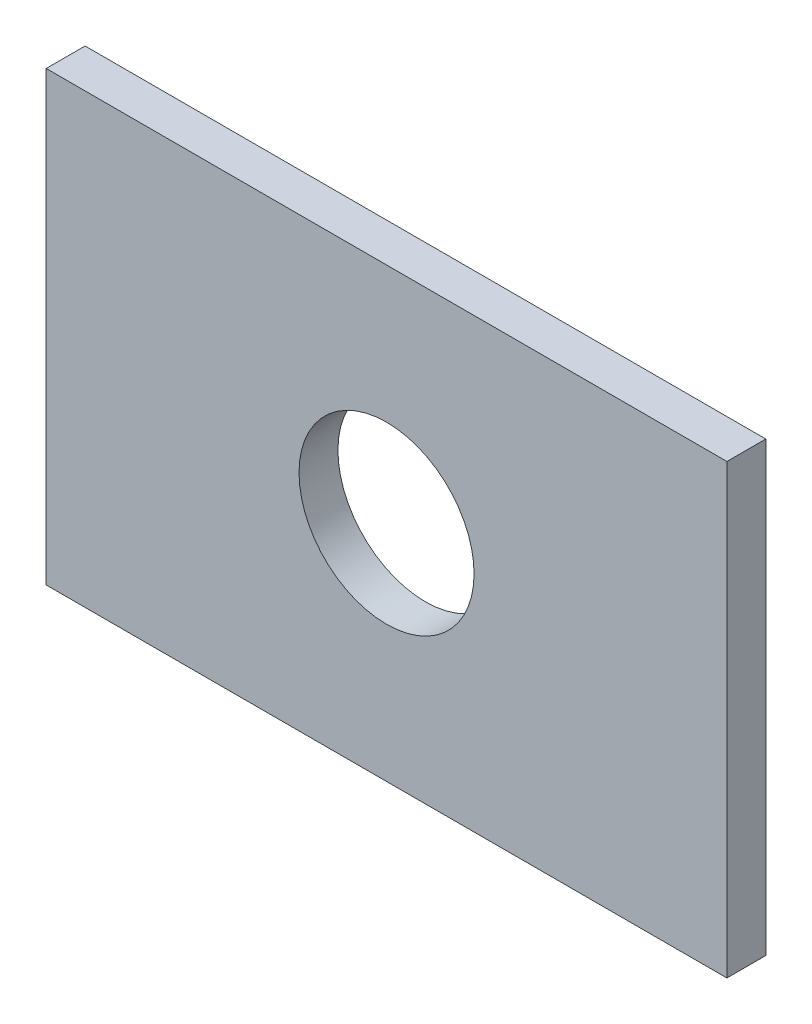
ISO-10303-21;
HEADER;
FILE_DESCRIPTION(('STEP AP214'),'2;1');
FILE_NAME('part.step','',(''),(''),'','','');
FILE_SCHEMA(('AUTOMOTIVE_DESIGN { 1 0 10303 214 1 1 1 1 }'));
ENDSEC;
DATA;
#1=APPLICATION_CONTEXT('core data for automotive mechanical design processes');
#2=APPLICATION_PROTOCOL_DEFINITION('international standard','automotive_design',2000,#1);
#3=PRODUCT_CONTEXT('',#1,'mechanical');
#4=PRODUCT('Part','Part','',(#3));
#5=PRODUCT_RELATED_PRODUCT_CATEGORY('part','',(#4));
#6=PRODUCT_DEFINITION_FORMATION('','',#4);
#7=PRODUCT_DEFINITION_CONTEXT('part definition',#1,'design');
#8=PRODUCT_DEFINITION('design','',#6,#7);
#9=PRODUCT_DEFINITION_SHAPE('','',#8);
#10=(LENGTH_UNIT() NAMED_UNIT(*) SI_UNIT(.MILLI.,.METRE.));
#11=(NAMED_UNIT(*) PLANE_ANGLE_UNIT() SI_UNIT($,.RADIAN.));
#12=(NAMED_UNIT(*) SI_UNIT($,.STERADIAN.) SOLID_ANGLE_UNIT());
#13=UNCERTAINTY_MEASURE_WITH_UNIT(LENGTH_MEASURE(1.E-05),#10,'distance_accuracy_value','');
#14=(GEOMETRIC_REPRESENTATION_CONTEXT(3) GLOBAL_UNCERTAINTY_ASSIGNED_CONTEXT((#13)) GLOBAL_UNIT_ASSIGNED_CONTEXT((#10,
#11,#12)) REPRESENTATION_CONTEXT('',''));
#15=CARTESIAN_POINT('',(0.,0.,0.));
#16=DIRECTION('',(0.,0.,1.));
#17=DIRECTION('',(1.,0.,0.));
#18=AXIS2_PLACEMENT_3D('',#15,#16,#17);
#19=CARTESIAN_POINT('',(0.,0.,2.));
#20=DIRECTION('',(0.,0.,-1.));
#21=DIRECTION('',(-1.,0.,0.));
#22=AXIS2_PLACEMENT_3D('',#19,#20,#21);
#23=PLANE('',#22);
#24=DIRECTION('',(0.,1.,0.));
#25=VECTOR('',#24,1.);
#26=CARTESIAN_POINT('',(17.5,-11.5,2.));
#27=LINE('',#26,#25);
#28=CARTESIAN_POINT('',(17.5,-11.5,2.));
#29=VERTEX_POINT('',#28);
#30=CARTESIAN_POINT('',(17.5,11.5,2.));
#31=VERTEX_POINT('',#30);
#32=EDGE_CURVE('E89',#29,#31,#27,.T.);
#33=ORIENTED_EDGE('',*,*,#32,.T.);
#34=DIRECTION('',(-1.,0.,0.));
#35=VECTOR('',#34,1.);
#36=CARTESIAN_POINT('',(-17.5,11.5,2.));
#37=LINE('',#36,#35);
#38=CARTESIAN_POINT('',(-17.5,11.5,2.));
#39=VERTEX_POINT('',#38);
#40=EDGE_CURVE('E84',#31,#39,#37,.T.);
#41=ORIENTED_EDGE('',*,*,#40,.T.);
#42=DIRECTION('',(0.,-1.,0.));
#43=VECTOR('',#42,1.);
#44=CARTESIAN_POINT('',(-17.5,-11.5,2.));
#45=LINE('',#44,#43);
#46=CARTESIAN_POINT('',(-17.5,-11.5,2.));
#47=VERTEX_POINT('',#46);
#48=EDGE_CURVE('E87',#39,#47,#45,.T.);
#49=ORIENTED_EDGE('',*,*,#48,.T.);
#50=DIRECTION('',(1.,0.,0.));
#51=VECTOR('',#50,1.);
#52=CARTESIAN_POINT('',(-17.5,-11.5,2.));
#53=LINE('',#52,#51);
#54=EDGE_CURVE('E54',#47,#29,#53,.T.);
#55=ORIENTED_EDGE('',*,*,#54,.T.);
#56=EDGE_LOOP('',(#33,#41,#49,#55));
#57=FACE_BOUND('',#56,.T.);
#58=CARTESIAN_POINT('',(0.,0.,2.));
#59=DIRECTION('',(0.,0.,1.));
#60=DIRECTION('',(1.,0.,0.));
#61=AXIS2_PLACEMENT_3D('',#58,#59,#60);
#62=CIRCLE('',#61,4.5);
#63=CARTESIAN_POINT('',(4.5,0.,2.));
#64=VERTEX_POINT('',#63);
#65=EDGE_CURVE('E104',#64,#64,#62,.T.);
#66=ORIENTED_EDGE('',*,*,#65,.F.);
#67=EDGE_LOOP('',(#66));
#68=FACE_BOUND('',#67,.T.);
#69=ADVANCED_FACE('F37',(#57,#68),#23,.F.);
#70=CARTESIAN_POINT('',(0.,0.,0.));
#71=DIRECTION('',(0.,0.,-1.));
#72=DIRECTION('',(-1.,0.,0.));
#73=AXIS2_PLACEMENT_3D('',#70,#71,#72);
#74=PLANE('',#73);
#75=DIRECTION('',(0.,1.,0.));
#76=VECTOR('',#75,1.);
#77=CARTESIAN_POINT('',(17.5,-11.5,0.));
#78=LINE('',#77,#76);
#79=CARTESIAN_POINT('',(17.5,-11.5,0.));
#80=VERTEX_POINT('',#79);
#81=CARTESIAN_POINT('',(17.5,11.5,0.));
#82=VERTEX_POINT('',#81);
#83=EDGE_CURVE('E101',#80,#82,#78,.T.);
#84=ORIENTED_EDGE('',*,*,#83,.F.);
#85=DIRECTION('',(1.,0.,0.));
#86=VECTOR('',#85,1.);
#87=CARTESIAN_POINT('',(-17.5,-11.5,0.));
#88=LINE('',#87,#86);
#89=CARTESIAN_POINT('',(-17.5,-11.5,0.));
#90=VERTEX_POINT('',#89);
#91=EDGE_CURVE('E77',#90,#80,#88,.T.);
#92=ORIENTED_EDGE('',*,*,#91,.F.);
#93=DIRECTION('',(0.,-1.,0.));
#94=VECTOR('',#93,1.);
#95=CARTESIAN_POINT('',(-17.5,-11.5,0.));
#96=LINE('',#95,#94);
#97=CARTESIAN_POINT('',(-17.5,11.5,0.));
#98=VERTEX_POINT('',#97);
#99=EDGE_CURVE('E71',#98,#90,#96,.T.);
#100=ORIENTED_EDGE('',*,*,#99,.F.);
#101=DIRECTION('',(-1.,0.,0.));
#102=VECTOR('',#101,1.);
#103=CARTESIAN_POINT('',(-17.5,11.5,0.));
#104=LINE('',#103,#102);
#105=EDGE_CURVE('E93',#82,#98,#104,.T.);
#106=ORIENTED_EDGE('',*,*,#105,.F.);
#107=EDGE_LOOP('',(#84,#92,#100,#106));
#108=FACE_BOUND('',#107,.T.);
#109=CARTESIAN_POINT('',(0.,0.,0.));
#110=DIRECTION('',(0.,0.,1.));
#111=DIRECTION('',(1.,0.,0.));
#112=AXIS2_PLACEMENT_3D('',#109,#110,#111);
#113=CIRCLE('',#112,4.5);
#114=CARTESIAN_POINT('',(4.5,0.,0.));
#115=VERTEX_POINT('',#114);
#116=EDGE_CURVE('E116',#115,#115,#113,.T.);
#117=ORIENTED_EDGE('',*,*,#116,.T.);
#118=EDGE_LOOP('',(#117));
#119=FACE_BOUND('',#118,.T.);
#120=ADVANCED_FACE('F112',(#108,#119),#74,.T.);
#121=CARTESIAN_POINT('',(17.5,-11.5,2.));
#122=DIRECTION('',(-1.,0.,0.));
#123=DIRECTION('',(0.,0.,1.));
#124=AXIS2_PLACEMENT_3D('',#121,#122,#123);
#125=PLANE('',#124);
#126=ORIENTED_EDGE('',*,*,#83,.T.);
#127=DIRECTION('',(0.,0.,-1.));
#128=VECTOR('',#127,1.);
#129=CARTESIAN_POINT('',(17.5,11.5,2.));
#130=LINE('',#129,#128);
#131=EDGE_CURVE('E11',#31,#82,#130,.T.);
#132=ORIENTED_EDGE('',*,*,#131,.F.);
#133=ORIENTED_EDGE('',*,*,#32,.F.);
#134=DIRECTION('',(0.,0.,-1.));
#135=VECTOR('',#134,1.);
#136=CARTESIAN_POINT('',(17.5,-11.5,2.));
#137=LINE('',#136,#135);
#138=EDGE_CURVE('E97',#29,#80,#137,.T.);
#139=ORIENTED_EDGE('',*,*,#138,.T.);
#140=EDGE_LOOP('',(#126,#132,#133,#139));
#141=FACE_BOUND('',#140,.T.);
#142=ADVANCED_FACE('F39',(#141),#125,.F.);
#143=CARTESIAN_POINT('',(-17.5,11.5,2.));
#144=DIRECTION('',(0.,-1.,0.));
#145=DIRECTION('',(0.,0.,-1.));
#146=AXIS2_PLACEMENT_3D('',#143,#144,#145);
#147=PLANE('',#146);
#148=ORIENTED_EDGE('',*,*,#105,.T.);
#149=DIRECTION('',(0.,0.,-1.));
#150=VECTOR('',#149,1.);
#151=CARTESIAN_POINT('',(-17.5,11.5,2.));
#152=LINE('',#151,#150);
#153=EDGE_CURVE('E46',#39,#98,#152,.T.);
#154=ORIENTED_EDGE('',*,*,#153,.F.);
#155=ORIENTED_EDGE('',*,*,#40,.F.);
#156=ORIENTED_EDGE('',*,*,#131,.T.);
#157=EDGE_LOOP('',(#148,#154,#155,#156));
#158=FACE_BOUND('',#157,.T.);
#159=ADVANCED_FACE('F92',(#158),#147,.F.);
#160=CARTESIAN_POINT('',(-17.5,-11.5,2.));
#161=DIRECTION('',(1.,0.,0.));
#162=DIRECTION('',(0.,0.,-1.));
#163=AXIS2_PLACEMENT_3D('',#160,#161,#162);
#164=PLANE('',#163);
#165=ORIENTED_EDGE('',*,*,#99,.T.);
#166=DIRECTION('',(0.,0.,-1.));
#167=VECTOR('',#166,1.);
#168=CARTESIAN_POINT('',(-17.5,-11.5,2.));
#169=LINE('',#168,#167);
#170=EDGE_CURVE('E94',#47,#90,#169,.T.);
#171=ORIENTED_EDGE('',*,*,#170,.F.);
#172=ORIENTED_EDGE('',*,*,#48,.F.);
#173=ORIENTED_EDGE('',*,*,#153,.T.);
#174=EDGE_LOOP('',(#165,#171,#172,#173));
#175=FACE_BOUND('',#174,.T.);
#176=ADVANCED_FACE('F95',(#175),#164,.F.);
#177=CARTESIAN_POINT('',(-17.5,-11.5,2.));
#178=DIRECTION('',(0.,1.,0.));
#179=DIRECTION('',(0.,0.,1.));
#180=AXIS2_PLACEMENT_3D('',#177,#178,#179);
#181=PLANE('',#180);
#182=ORIENTED_EDGE('',*,*,#91,.T.);
#183=ORIENTED_EDGE('',*,*,#138,.F.);
#184=ORIENTED_EDGE('',*,*,#54,.F.);
#185=ORIENTED_EDGE('',*,*,#170,.T.);
#186=EDGE_LOOP('',(#182,#183,#184,#185));
#187=FACE_BOUND('',#186,.T.);
#188=ADVANCED_FACE('F109',(#187),#181,.F.);
#189=CARTESIAN_POINT('',(0.,0.,2.));
#190=DIRECTION('',(0.,0.,-1.));
#191=DIRECTION('',(-1.,0.,0.));
#192=AXIS2_PLACEMENT_3D('',#189,#190,#191);
#193=CYLINDRICAL_SURFACE('',#192,4.5);
#194=ORIENTED_EDGE('',*,*,#65,.T.);
#195=EDGE_LOOP('',(#194));
#196=FACE_BOUND('',#195,.T.);
#197=ORIENTED_EDGE('',*,*,#116,.F.);
#198=EDGE_LOOP('',(#197));
#199=FACE_BOUND('',#198,.T.);
#200=ADVANCED_FACE('F122',(#196,#199),#193,.F.);
#201=CLOSED_SHELL('',(#69,#120,#142,#159,#176,#188,#200));
#202=MANIFOLD_SOLID_BREP('B2',#201);
#203=ADVANCED_BREP_SHAPE_REPRESENTATION('',(#18,#202),#14);
#204=SHAPE_DEFINITION_REPRESENTATION(#9,#203);
ENDSEC;
END-ISO-10303-21;
